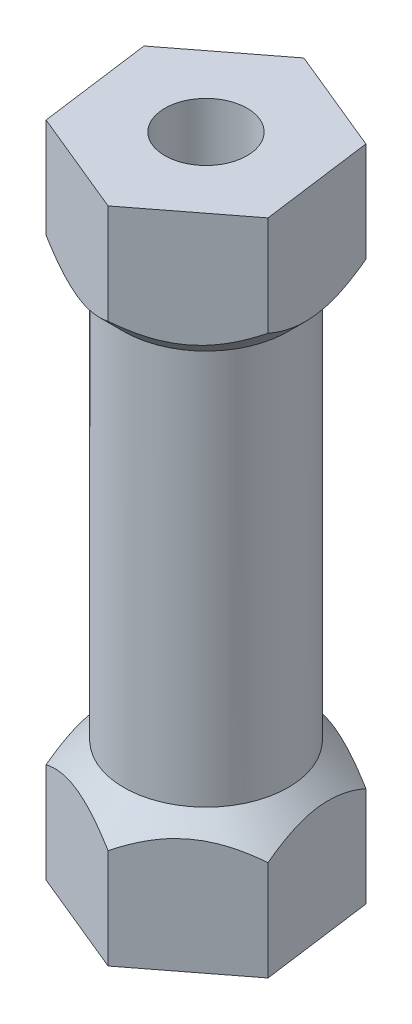
ISO-10303-21;
HEADER;
FILE_DESCRIPTION(('STEP AP214'),'2;1');
FILE_NAME('part.step','',(''),(''),'','','');
FILE_SCHEMA(('AUTOMOTIVE_DESIGN { 1 0 10303 214 1 1 1 1 }'));
ENDSEC;
DATA;
#1=APPLICATION_CONTEXT('core data for automotive mechanical design processes');
#2=APPLICATION_PROTOCOL_DEFINITION('international standard','automotive_design',2000,#1);
#3=PRODUCT_CONTEXT('',#1,'mechanical');
#4=PRODUCT('Part','Part','',(#3));
#5=PRODUCT_RELATED_PRODUCT_CATEGORY('part','',(#4));
#6=PRODUCT_DEFINITION_FORMATION('','',#4);
#7=PRODUCT_DEFINITION_CONTEXT('part definition',#1,'design');
#8=PRODUCT_DEFINITION('design','',#6,#7);
#9=PRODUCT_DEFINITION_SHAPE('','',#8);
#10=(LENGTH_UNIT() NAMED_UNIT(*) SI_UNIT(.MILLI.,.METRE.));
#11=(NAMED_UNIT(*) PLANE_ANGLE_UNIT() SI_UNIT($,.RADIAN.));
#12=(NAMED_UNIT(*) SI_UNIT($,.STERADIAN.) SOLID_ANGLE_UNIT());
#13=UNCERTAINTY_MEASURE_WITH_UNIT(LENGTH_MEASURE(1.E-05),#10,'distance_accuracy_value','');
#14=(GEOMETRIC_REPRESENTATION_CONTEXT(3) GLOBAL_UNCERTAINTY_ASSIGNED_CONTEXT((#13)) GLOBAL_UNIT_ASSIGNED_CONTEXT((#10,
#11,#12)) REPRESENTATION_CONTEXT('',''));
#15=CARTESIAN_POINT('',(0.,0.,0.));
#16=DIRECTION('',(0.,0.,1.));
#17=DIRECTION('',(1.,0.,0.));
#18=AXIS2_PLACEMENT_3D('',#15,#16,#17);
#19=CARTESIAN_POINT('',(0.,20.,0.));
#20=DIRECTION('',(0.,-1.,0.));
#21=DIRECTION('',(0.,0.,-1.));
#22=AXIS2_PLACEMENT_3D('',#19,#20,#21);
#23=CYLINDRICAL_SURFACE('',#22,2.5);
#24=CARTESIAN_POINT('',(0.,4.00000000000001,0.));
#25=DIRECTION('',(0.,-1.,0.));
#26=DIRECTION('',(0.,0.,-1.));
#27=AXIS2_PLACEMENT_3D('',#24,#25,#26);
#28=CIRCLE('',#27,2.5);
#29=CARTESIAN_POINT('',(0.,4.00000000000001,-2.5));
#30=VERTEX_POINT('',#29);
#31=EDGE_CURVE('E214',#30,#30,#28,.F.);
#32=ORIENTED_EDGE('',*,*,#31,.T.);
#33=EDGE_LOOP('',(#32));
#34=FACE_BOUND('',#33,.T.);
#35=CARTESIAN_POINT('',(0.,16.,0.));
#36=DIRECTION('',(0.,1.,0.));
#37=DIRECTION('',(0.,0.,1.));
#38=AXIS2_PLACEMENT_3D('',#35,#36,#37);
#39=CIRCLE('',#38,2.5);
#40=CARTESIAN_POINT('',(0.,16.,2.5));
#41=VERTEX_POINT('',#40);
#42=EDGE_CURVE('E204',#41,#41,#39,.F.);
#43=ORIENTED_EDGE('',*,*,#42,.T.);
#44=EDGE_LOOP('',(#43));
#45=FACE_BOUND('',#44,.T.);
#46=ADVANCED_FACE('F36',(#34,#45),#23,.T.);
#47=CARTESIAN_POINT('',(0.458624426145962,17.,3.43360796185911));
#48=DIRECTION('',(0.61025472680424,0.,0.792205256491701));
#49=DIRECTION('',(0.792205256491702,0.,-0.61025472680424));
#50=AXIS2_PLACEMENT_3D('',#47,#48,#49);
#51=PLANE('',#50);
#52=DIRECTION('',(0.792205256491701,0.,-0.61025472680424));
#53=VECTOR('',#52,1.);
#54=CARTESIAN_POINT('',(0.458624426145962,20.,3.43360796185911));
#55=LINE('',#54,#53);
#56=CARTESIAN_POINT('',(0.458624426145962,20.,3.43360796185911));
#57=VERTEX_POINT('',#56);
#58=CARTESIAN_POINT('',(3.20290393467948,20.,1.3196235770911));
#59=VERTEX_POINT('',#58);
#60=EDGE_CURVE('E176',#57,#59,#55,.T.);
#61=ORIENTED_EDGE('',*,*,#60,.F.);
#62=DIRECTION('',(0.,1.,0.));
#63=VECTOR('',#62,1.);
#64=CARTESIAN_POINT('',(0.458624426145962,17.,3.43360796185911));
#65=LINE('',#64,#63);
#66=CARTESIAN_POINT('',(0.458624426145962,16.9641016151377,3.43360796185911));
#67=VERTEX_POINT('',#66);
#68=EDGE_CURVE('E202',#67,#57,#65,.T.);
#69=ORIENTED_EDGE('',*,*,#68,.F.);
#70=CARTESIAN_POINT('',(0.458624426145962,16.9641016151377,3.43360796185911));
#71=CARTESIAN_POINT('',(0.552946646940671,16.9046273115043,3.36094929087585));
#72=CARTESIAN_POINT('',(0.648845946533506,16.8486466143714,3.28707575823494));
#73=CARTESIAN_POINT('',(0.844394459739393,16.7461483479953,3.13644004416266));
#74=CARTESIAN_POINT('',(0.944062259864258,16.6996877901198,3.05966354509507));
#75=CARTESIAN_POINT('',(1.14503747135759,16.6201005343435,2.90484751505832));
#76=CARTESIAN_POINT('',(1.24629372827786,16.586773851006,2.82684738958863));
#77=CARTESIAN_POINT('',(1.45103485264414,16.5354277758299,2.66913038646112));
#78=CARTESIAN_POINT('',(1.55451346985746,16.517370070364,2.58941832350757));
#79=CARTESIAN_POINT('',(1.73286339917489,16.5010768517386,2.45203109147486));
#80=CARTESIAN_POINT('',(1.80750452739339,16.4986656112775,2.39453323856858));
#81=CARTESIAN_POINT('',(1.9566652769835,16.502733133148,2.27963113239708));
#82=CARTESIAN_POINT('',(2.03118484660152,16.5092150115048,2.22222691899889));
#83=CARTESIAN_POINT('',(2.17951789139027,16.5306986609621,2.10796241370582));
#84=CARTESIAN_POINT('',(2.25333048312972,16.5457099577167,2.05110280233924));
#85=CARTESIAN_POINT('',(2.3996879271144,16.5834331286294,1.93836014977194));
#86=CARTESIAN_POINT('',(2.47223287613645,16.6061444122156,1.8824770340217));
#87=CARTESIAN_POINT('',(2.60100408474849,16.6528653293044,1.78328148073819));
#88=CARTESIAN_POINT('',(2.65751570690211,16.675645478675,1.73974922157174));
#89=CARTESIAN_POINT('',(2.76952470482908,16.7248761548282,1.65346600157362));
#90=CARTESIAN_POINT('',(2.82502204996649,16.7513267922701,1.61071506434156));
#91=CARTESIAN_POINT('',(2.93482762154907,16.8073056985693,1.52612919655211));
#92=CARTESIAN_POINT('',(2.989138970775,16.8368242879627,1.48429186044175));
#93=CARTESIAN_POINT('',(3.09675613798931,16.898551669424,1.40139177307215));
#94=CARTESIAN_POINT('',(3.15006254800882,16.9307588127747,1.36032856575713));
#95=CARTESIAN_POINT('',(3.20290393467948,16.9641016151377,1.3196235770911));
#96=B_SPLINE_CURVE_WITH_KNOTS('',3,(#70,#71,#72,#73,#74,#75,#76,#77,#78,#79,#80,#81,#82,#83,#84,
#85,#86,#87,#88,#89,#90,#91,#92,#93,#94,#95),.UNSPECIFIED.,.F.,.F.,(4,2,2,2,2,2,2,2,2,2,2,2,4),
(0.,0.399548839742044,0.801424624398822,1.19691998044429,1.59141997110855,1.87377108834638,
2.15622116275999,2.43898729915556,2.72173175291771,2.94627735489484,3.17082972803501,
3.39469398397017,3.61842195288712),.UNSPECIFIED.);
#97=CARTESIAN_POINT('',(3.20290393467948,16.9641016151377,1.3196235770911));
#98=VERTEX_POINT('',#97);
#99=EDGE_CURVE('E262',#67,#98,#96,.T.);
#100=ORIENTED_EDGE('',*,*,#99,.T.);
#101=DIRECTION('',(0.,1.,0.));
#102=VECTOR('',#101,1.);
#103=CARTESIAN_POINT('',(3.20290393467948,17.,1.3196235770911));
#104=LINE('',#103,#102);
#105=EDGE_CURVE('E201',#98,#59,#104,.T.);
#106=ORIENTED_EDGE('',*,*,#105,.T.);
#107=EDGE_LOOP('',(#61,#69,#100,#106));
#108=FACE_BOUND('',#107,.T.);
#109=ADVANCED_FACE('F273',(#108),#51,.T.);
#110=CARTESIAN_POINT('',(-2.74427950853352,17.,2.11398438476802));
#111=DIRECTION('',(-0.38094251373126,0.,0.924598724437855));
#112=DIRECTION('',(0.924598724437855,0.,0.380942513731261));
#113=AXIS2_PLACEMENT_3D('',#110,#111,#112);
#114=PLANE('',#113);
#115=DIRECTION('',(0.924598724437855,0.,0.38094251373126));
#116=VECTOR('',#115,1.);
#117=CARTESIAN_POINT('',(-2.74427950853352,20.,2.11398438476802));
#118=LINE('',#117,#116);
#119=CARTESIAN_POINT('',(-2.74427950853352,20.,2.11398438476802));
#120=VERTEX_POINT('',#119);
#121=EDGE_CURVE('E198',#120,#57,#118,.T.);
#122=ORIENTED_EDGE('',*,*,#121,.F.);
#123=DIRECTION('',(0.,1.,0.));
#124=VECTOR('',#123,1.);
#125=CARTESIAN_POINT('',(-2.74427950853352,17.,2.11398438476802));
#126=LINE('',#125,#124);
#127=CARTESIAN_POINT('',(-2.74427950853352,16.9641016151377,2.11398438476802));
#128=VERTEX_POINT('',#127);
#129=EDGE_CURVE('E55',#128,#120,#126,.T.);
#130=ORIENTED_EDGE('',*,*,#129,.F.);
#131=CARTESIAN_POINT('',(-2.74427950853352,16.9641016151377,2.11398438476802));
#132=CARTESIAN_POINT('',(-2.63349132278802,16.9042465561435,2.1596300566191));
#133=CARTESIAN_POINT('',(-2.5208306752984,16.8479276158537,2.20604719858453));
#134=CARTESIAN_POINT('',(-2.29101765072446,16.7448671131009,2.30073211319179));
#135=CARTESIAN_POINT('',(-2.17384124974193,16.6981887865374,2.34900978388337));
#136=CARTESIAN_POINT('',(-1.93912067100053,16.6189182952453,2.4457166524166));
#137=CARTESIAN_POINT('',(-1.82168615710399,16.5859561697386,2.49410066781718));
#138=CARTESIAN_POINT('',(-1.58429793865649,16.5351709539857,2.59190662652706));
#139=CARTESIAN_POINT('',(-1.46435309270892,16.5173016151636,2.64132492001665));
#140=CARTESIAN_POINT('',(-1.31052706825295,16.5052592473864,2.70470254631521));
#141=CARTESIAN_POINT('',(-1.27709425611575,16.5032939655895,2.71847714837774));
#142=CARTESIAN_POINT('',(-1.21005238331492,16.5006622772178,2.74609896839001));
#143=CARTESIAN_POINT('',(-1.17644314907664,16.5000010463362,2.75994625785399));
#144=CARTESIAN_POINT('',(-1.14282754119378,16.5,2.77379617331357));
#145=B_SPLINE_CURVE_WITH_KNOTS('',3,(#131,#132,#133,#134,#135,#136,#137,#138,#139,#140,#141,
#142,#143,#144),.UNSPECIFIED.,.F.,.F.,(4,2,2,2,2,2,4),(0.,0.402119025873333,0.806797313868012,
1.19971436997847,1.59142300305554,1.70004402806134,1.80909530210899),.UNSPECIFIED.);
#146=CARTESIAN_POINT('',(-1.14282754119378,16.5,2.77379617331357));
#147=VERTEX_POINT('',#146);
#148=EDGE_CURVE('E11',#128,#147,#145,.T.);
#149=ORIENTED_EDGE('',*,*,#148,.T.);
#150=CARTESIAN_POINT('',(-1.14282754119378,16.5,2.77379617331357));
#151=CARTESIAN_POINT('',(-1.10022501513962,16.4999963101781,2.79134877525582));
#152=CARTESIAN_POINT('',(-1.05762885810082,16.5010620671615,2.80889875310975));
#153=CARTESIAN_POINT('',(-0.972532570372322,16.5052977157884,2.8439591451476));
#154=CARTESIAN_POINT('',(-0.930032425632245,16.5084672764404,2.86146956512041));
#155=CARTESIAN_POINT('',(-0.802948427577587,16.5210634368764,2.91382924980783));
#156=CARTESIAN_POINT('',(-0.718612061023148,16.5335777900352,2.94857654787894));
#157=CARTESIAN_POINT('',(-0.552496648265973,16.5659327147617,3.01701750635387));
#158=CARTESIAN_POINT('',(-0.470698216277369,16.5856599472331,3.05071915386583));
#159=CARTESIAN_POINT('',(-0.308653419442774,16.6315827359299,3.11748298406771));
#160=CARTESIAN_POINT('',(-0.228407549190369,16.6577803179604,3.15054496298087));
#161=CARTESIAN_POINT('',(-0.0971701649973123,16.7056533901419,3.20461587797204));
#162=CARTESIAN_POINT('',(-0.0456767048713384,16.7257503469628,3.22583162013417));
#163=CARTESIAN_POINT('',(0.0565560250602171,16.768042758048,3.26795237165198));
#164=CARTESIAN_POINT('',(0.107295451337837,16.7902377696978,3.28885744547548));
#165=CARTESIAN_POINT('',(0.208559810145813,16.836730315952,3.33057921987999));
#166=CARTESIAN_POINT('',(0.259077099688516,16.8610472180228,3.35139277148529));
#167=CARTESIAN_POINT('',(0.359386521866436,16.9113651449045,3.39272110390174));
#168=CARTESIAN_POINT('',(0.409178702526936,16.9373660575531,3.4132359044997));
#169=CARTESIAN_POINT('',(0.458624426145963,16.9641016151377,3.43360796185912));
#170=B_SPLINE_CURVE_WITH_KNOTS('',3,(#150,#151,#152,#153,#154,#155,#156,#157,#158,#159,#160,
#161,#162,#163,#164,#165,#166,#167,#168,#169),.UNSPECIFIED.,.F.,.F.,(4,2,2,2,2,2,2,2,2,4),(0.,
0.138204825620452,0.276387912612568,0.552207964781785,0.823868153652891,1.0956135048085,
1.27319714786855,1.45074341038052,1.6301255414403,1.80949573715897),.UNSPECIFIED.);
#171=EDGE_CURVE('E251',#147,#67,#170,.T.);
#172=ORIENTED_EDGE('',*,*,#171,.T.);
#173=ORIENTED_EDGE('',*,*,#68,.T.);
#174=EDGE_LOOP('',(#122,#130,#149,#172,#173));
#175=FACE_BOUND('',#174,.T.);
#176=ADVANCED_FACE('F268',(#175),#114,.T.);
#177=CARTESIAN_POINT('',(-3.20290393467948,17.,-1.3196235770911));
#178=DIRECTION('',(-0.9911972405355,0.,0.132393467946154));
#179=DIRECTION('',(0.132393467946154,0.,0.991197240535501));
#180=AXIS2_PLACEMENT_3D('',#177,#178,#179);
#181=PLANE('',#180);
#182=DIRECTION('',(0.132393467946154,0.,0.991197240535501));
#183=VECTOR('',#182,1.);
#184=CARTESIAN_POINT('',(-3.20290393467948,20.,-1.3196235770911));
#185=LINE('',#184,#183);
#186=CARTESIAN_POINT('',(-3.20290393467948,20.,-1.3196235770911));
#187=VERTEX_POINT('',#186);
#188=EDGE_CURVE('E195',#187,#120,#185,.T.);
#189=ORIENTED_EDGE('',*,*,#188,.F.);
#190=DIRECTION('',(0.,1.,0.));
#191=VECTOR('',#190,1.);
#192=CARTESIAN_POINT('',(-3.20290393467948,17.,-1.3196235770911));
#193=LINE('',#192,#191);
#194=CARTESIAN_POINT('',(-3.20290393467948,16.9641016151377,-1.3196235770911));
#195=VERTEX_POINT('',#194);
#196=EDGE_CURVE('E62',#195,#187,#193,.T.);
#197=ORIENTED_EDGE('',*,*,#196,.F.);
#198=CARTESIAN_POINT('',(-3.20290393467948,16.9641016151377,-1.3196235770911));
#199=CARTESIAN_POINT('',(-3.18714079020011,16.9046273115043,-1.20160880224988));
#200=CARTESIAN_POINT('',(-3.1711140840622,16.8486466143714,-1.08162080627689));
#201=CARTESIAN_POINT('',(-3.13843398556135,16.7461483479953,-0.836952969132185));
#202=CARTESIAN_POINT('',(-3.12177748701761,16.6996877901198,-0.712249872750944));
#203=CARTESIAN_POINT('',(-3.0881904778394,16.6201005343435,-0.460792219048395));
#204=CARTESIAN_POINT('',(-3.07126851614441,16.586773851006,-0.334101665528472));
#205=CARTESIAN_POINT('',(-3.03705214701037,16.5354277758299,-0.0779321490641273));
#206=CARTESIAN_POINT('',(-3.0197587841112,16.517370070364,0.0515389936678654));
#207=CARTESIAN_POINT('',(-2.98995291567395,16.5010768517386,0.274688179236281));
#208=CARTESIAN_POINT('',(-2.9774788785033,16.4986656112775,0.368078218893769));
#209=CARTESIAN_POINT('',(-2.9525511104055,16.502733133148,0.554706270372082));
#210=CARTESIAN_POINT('',(-2.94009738812742,16.5092150115048,0.64794421743947));
#211=CARTESIAN_POINT('',(-2.91530794618713,16.5306986609621,0.833536655093753));
#212=CARTESIAN_POINT('',(-2.9029723741641,16.5457099577167,0.925890040342578));
#213=CARTESIAN_POINT('',(-2.87851309494311,16.5834331286294,1.10901063114992));
#214=CARTESIAN_POINT('',(-2.86638937157179,16.6061444122156,1.19977795779438));
#215=CARTESIAN_POINT('',(-2.84486910679185,16.6528653293044,1.36089487237019));
#216=CARTESIAN_POINT('',(-2.83542487554638,16.675645478675,1.43160150234752));
#217=CARTESIAN_POINT('',(-2.81670591407117,16.7248761548282,1.57174575000377));
#218=CARTESIAN_POINT('',(-2.80743118896132,16.7513267922701,1.64118332935139));
#219=CARTESIAN_POINT('',(-2.78908046444579,16.8073056985693,1.7785706777137));
#220=CARTESIAN_POINT('',(-2.78000394316052,16.8368242879627,1.84652435391235));
#221=CARTESIAN_POINT('',(-2.76201894512965,16.898551669424,1.98117359828805));
#222=CARTESIAN_POINT('',(-2.75311036944373,16.9307588127747,2.04786990720701));
#223=CARTESIAN_POINT('',(-2.74427950853352,16.9641016151377,2.11398438476802));
#224=B_SPLINE_CURVE_WITH_KNOTS('',3,(#198,#199,#200,#201,#202,#203,#204,#205,#206,#207,#208,
#209,#210,#211,#212,#213,#214,#215,#216,#217,#218,#219,#220,#221,#222,#223),.UNSPECIFIED.,.F.,
.F.,(4,2,2,2,2,2,2,2,2,2,2,2,4),(0.,0.399548839742042,0.801424624398821,1.19691998044429,
1.59141997110855,1.87377108834638,2.15622116275999,2.43898729915556,2.72173175291771,
2.94627735489484,3.17082972803501,3.39469398397017,3.61842195288713),.UNSPECIFIED.);
#225=EDGE_CURVE('E49',#195,#128,#224,.T.);
#226=ORIENTED_EDGE('',*,*,#225,.T.);
#227=ORIENTED_EDGE('',*,*,#129,.T.);
#228=EDGE_LOOP('',(#189,#197,#226,#227));
#229=FACE_BOUND('',#228,.T.);
#230=ADVANCED_FACE('F272',(#229),#181,.T.);
#231=CARTESIAN_POINT('',(-0.45862442614596,17.,-3.43360796185911));
#232=DIRECTION('',(-0.61025472680424,0.,-0.792205256491701));
#233=DIRECTION('',(-0.792205256491702,0.,0.61025472680424));
#234=AXIS2_PLACEMENT_3D('',#231,#232,#233);
#235=PLANE('',#234);
#236=DIRECTION('',(-0.792205256491701,0.,0.61025472680424));
#237=VECTOR('',#236,1.);
#238=CARTESIAN_POINT('',(-0.45862442614596,20.,-3.43360796185911));
#239=LINE('',#238,#237);
#240=CARTESIAN_POINT('',(-0.45862442614596,20.,-3.43360796185911));
#241=VERTEX_POINT('',#240);
#242=EDGE_CURVE('E192',#241,#187,#239,.T.);
#243=ORIENTED_EDGE('',*,*,#242,.F.);
#244=DIRECTION('',(0.,1.,0.));
#245=VECTOR('',#244,1.);
#246=CARTESIAN_POINT('',(-0.45862442614596,17.,-3.43360796185911));
#247=LINE('',#246,#245);
#248=CARTESIAN_POINT('',(-0.45862442614596,16.9641016151377,-3.43360796185911));
#249=VERTEX_POINT('',#248);
#250=EDGE_CURVE('E207',#249,#241,#247,.T.);
#251=ORIENTED_EDGE('',*,*,#250,.F.);
#252=CARTESIAN_POINT('',(-0.45862442614596,16.9641016151377,-3.43360796185911));
#253=CARTESIAN_POINT('',(-0.552946646940669,16.9046273115043,-3.36094929087585));
#254=CARTESIAN_POINT('',(-0.648845946533503,16.8486466143714,-3.28707575823493));
#255=CARTESIAN_POINT('',(-0.84439445973939,16.7461483479953,-3.13644004416266));
#256=CARTESIAN_POINT('',(-0.944062259864255,16.6996877901198,-3.05966354509507));
#257=CARTESIAN_POINT('',(-1.14503747135759,16.6201005343435,-2.90484751505832));
#258=CARTESIAN_POINT('',(-1.24629372827786,16.586773851006,-2.82684738958863));
#259=CARTESIAN_POINT('',(-1.45103485264414,16.5354277758299,-2.66913038646112));
#260=CARTESIAN_POINT('',(-1.55451346985746,16.517370070364,-2.58941832350757));
#261=CARTESIAN_POINT('',(-1.73286339917489,16.5010768517386,-2.45203109147485));
#262=CARTESIAN_POINT('',(-1.80750452739338,16.4986656112775,-2.39453323856858));
#263=CARTESIAN_POINT('',(-1.95666527698349,16.502733133148,-2.27963113239708));
#264=CARTESIAN_POINT('',(-2.03118484660152,16.5092150115048,-2.22222691899889));
#265=CARTESIAN_POINT('',(-2.17951789139026,16.5306986609621,-2.10796241370582));
#266=CARTESIAN_POINT('',(-2.25333048312972,16.5457099577167,-2.05110280233924));
#267=CARTESIAN_POINT('',(-2.3996879271144,16.5834331286294,-1.93836014977194));
#268=CARTESIAN_POINT('',(-2.47223287613644,16.6061444122156,-1.8824770340217));
#269=CARTESIAN_POINT('',(-2.60100408474849,16.6528653293044,-1.78328148073819));
#270=CARTESIAN_POINT('',(-2.65751570690211,16.675645478675,-1.73974922157174));
#271=CARTESIAN_POINT('',(-2.76952470482908,16.7248761548282,-1.65346600157362));
#272=CARTESIAN_POINT('',(-2.82502204996649,16.7513267922701,-1.61071506434155));
#273=CARTESIAN_POINT('',(-2.93482762154907,16.8073056985693,-1.52612919655211));
#274=CARTESIAN_POINT('',(-2.989138970775,16.8368242879627,-1.48429186044174));
#275=CARTESIAN_POINT('',(-3.09675613798931,16.898551669424,-1.40139177307215));
#276=CARTESIAN_POINT('',(-3.15006254800882,16.9307588127747,-1.36032856575712));
#277=CARTESIAN_POINT('',(-3.20290393467948,16.9641016151377,-1.3196235770911));
#278=B_SPLINE_CURVE_WITH_KNOTS('',3,(#252,#253,#254,#255,#256,#257,#258,#259,#260,#261,#262,
#263,#264,#265,#266,#267,#268,#269,#270,#271,#272,#273,#274,#275,#276,#277),.UNSPECIFIED.,.F.,
.F.,(4,2,2,2,2,2,2,2,2,2,2,2,4),(0.,0.399548839742042,0.801424624398821,1.19691998044429,
1.59141997110855,1.87377108834638,2.15622116275999,2.43898729915555,2.72173175291771,
2.94627735489484,3.17082972803501,3.39469398397017,3.61842195288712),.UNSPECIFIED.);
#279=EDGE_CURVE('E287',#249,#195,#278,.T.);
#280=ORIENTED_EDGE('',*,*,#279,.T.);
#281=ORIENTED_EDGE('',*,*,#196,.T.);
#282=EDGE_LOOP('',(#243,#251,#280,#281));
#283=FACE_BOUND('',#282,.T.);
#284=ADVANCED_FACE('F280',(#283),#235,.T.);
#285=CARTESIAN_POINT('',(2.74427950853352,17.,-2.11398438476802));
#286=DIRECTION('',(0.380942513731261,0.,-0.924598724437855));
#287=DIRECTION('',(-0.924598724437855,0.,-0.380942513731261));
#288=AXIS2_PLACEMENT_3D('',#285,#286,#287);
#289=PLANE('',#288);
#290=DIRECTION('',(-0.924598724437855,0.,-0.380942513731261));
#291=VECTOR('',#290,1.);
#292=CARTESIAN_POINT('',(2.74427950853352,20.,-2.11398438476802));
#293=LINE('',#292,#291);
#294=CARTESIAN_POINT('',(2.74427950853352,20.,-2.11398438476802));
#295=VERTEX_POINT('',#294);
#296=EDGE_CURVE('E189',#295,#241,#293,.T.);
#297=ORIENTED_EDGE('',*,*,#296,.F.);
#298=DIRECTION('',(0.,1.,0.));
#299=VECTOR('',#298,1.);
#300=CARTESIAN_POINT('',(2.74427950853352,17.,-2.11398438476802));
#301=LINE('',#300,#299);
#302=CARTESIAN_POINT('',(2.74427950853352,16.9641016151377,-2.11398438476802));
#303=VERTEX_POINT('',#302);
#304=EDGE_CURVE('E209',#303,#295,#301,.T.);
#305=ORIENTED_EDGE('',*,*,#304,.F.);
#306=CARTESIAN_POINT('',(2.74427950853352,16.9641016151377,-2.11398438476802));
#307=CARTESIAN_POINT('',(2.63419414325944,16.9046273115043,-2.15934048862597));
#308=CARTESIAN_POINT('',(2.5222681375287,16.8486466143714,-2.20545495195804));
#309=CARTESIAN_POINT('',(2.29403952582196,16.7461483479953,-2.29948707503048));
#310=CARTESIAN_POINT('',(2.17771522715335,16.6996877901198,-2.34741367234412));
#311=CARTESIAN_POINT('',(1.94315300648181,16.6201005343435,-2.44405529600993));
#312=CARTESIAN_POINT('',(1.82497478786655,16.586773851006,-2.49274572406016));
#313=CARTESIAN_POINT('',(1.58601729436623,16.5354277758299,-2.59119823739699));
#314=CARTESIAN_POINT('',(1.46524531425374,16.517370070364,-2.64095731717544));
#315=CARTESIAN_POINT('',(1.25708951649906,16.5010768517386,-2.72671927071113));
#316=CARTESIAN_POINT('',(1.16997435110992,16.4986656112775,-2.76261145746235));
#317=CARTESIAN_POINT('',(0.995885833422009,16.502733133148,-2.83433740276916));
#318=CARTESIAN_POINT('',(0.908912541525901,16.5092150115048,-2.87017113643836));
#319=CARTESIAN_POINT('',(0.735790054796867,16.5306986609621,-2.94149906879957));
#320=CARTESIAN_POINT('',(0.649641891034376,16.5457099577167,-2.97699284268182));
#321=CARTESIAN_POINT('',(0.478825167828706,16.5834331286294,-3.04737078092186));
#322=CARTESIAN_POINT('',(0.394156495435349,16.6061444122156,-3.08225499181607));
#323=CARTESIAN_POINT('',(0.243865022043358,16.6528653293044,-3.14417635310838));
#324=CARTESIAN_POINT('',(0.177909168644273,16.675645478675,-3.17135072391926));
#325=CARTESIAN_POINT('',(0.0471812092420944,16.7248761548282,-3.22521175157739));
#326=CARTESIAN_POINT('',(-0.0175908610051715,16.7513267922701,-3.25189839369295));
#327=CARTESIAN_POINT('',(-0.145747157103273,16.8073056985693,-3.30469987426581));
#328=CARTESIAN_POINT('',(-0.209135027614486,16.8368242879627,-3.33081621435409));
#329=CARTESIAN_POINT('',(-0.334737192859661,16.898551669424,-3.38256537136021));
#330=CARTESIAN_POINT('',(-0.396952178565091,16.9307588127747,-3.40819847296414));
#331=CARTESIAN_POINT('',(-0.45862442614596,16.9641016151377,-3.43360796185911));
#332=B_SPLINE_CURVE_WITH_KNOTS('',3,(#306,#307,#308,#309,#310,#311,#312,#313,#314,#315,#316,
#317,#318,#319,#320,#321,#322,#323,#324,#325,#326,#327,#328,#329,#330,#331),.UNSPECIFIED.,.F.,
.F.,(4,2,2,2,2,2,2,2,2,2,2,2,4),(0.,0.399548839742044,0.801424624398823,1.19691998044429,
1.59141997110856,1.87377108834638,2.15622116275999,2.43898729915556,2.72173175291771,
2.94627735489484,3.17082972803501,3.39469398397018,3.61842195288713),.UNSPECIFIED.);
#333=EDGE_CURVE('E292',#303,#249,#332,.T.);
#334=ORIENTED_EDGE('',*,*,#333,.T.);
#335=ORIENTED_EDGE('',*,*,#250,.T.);
#336=EDGE_LOOP('',(#297,#305,#334,#335));
#337=FACE_BOUND('',#336,.T.);
#338=ADVANCED_FACE('F302',(#337),#289,.T.);
#339=CARTESIAN_POINT('',(3.20290393467948,17.,1.3196235770911));
#340=DIRECTION('',(0.9911972405355,0.,-0.132393467946154));
#341=DIRECTION('',(-0.132393467946154,0.,-0.991197240535501));
#342=AXIS2_PLACEMENT_3D('',#339,#340,#341);
#343=PLANE('',#342);
#344=DIRECTION('',(-0.132393467946154,0.,-0.991197240535501));
#345=VECTOR('',#344,1.);
#346=CARTESIAN_POINT('',(3.20290393467948,20.,1.3196235770911));
#347=LINE('',#346,#345);
#348=EDGE_CURVE('E186',#59,#295,#347,.T.);
#349=ORIENTED_EDGE('',*,*,#348,.F.);
#350=ORIENTED_EDGE('',*,*,#105,.F.);
#351=CARTESIAN_POINT('',(3.20290393467948,16.9641016151377,1.3196235770911));
#352=CARTESIAN_POINT('',(3.18714079020011,16.9046273115043,1.20160880224988));
#353=CARTESIAN_POINT('',(3.1711140840622,16.8486466143714,1.0816208062769));
#354=CARTESIAN_POINT('',(3.13843398556135,16.7461483479953,0.836952969132185));
#355=CARTESIAN_POINT('',(3.12177748701761,16.6996877901198,0.712249872750943));
#356=CARTESIAN_POINT('',(3.0881904778394,16.6201005343435,0.460792219048394));
#357=CARTESIAN_POINT('',(3.07126851614441,16.586773851006,0.334101665528469));
#358=CARTESIAN_POINT('',(3.03705214701037,16.5354277758299,0.0779321490641238));
#359=CARTESIAN_POINT('',(3.0197587841112,16.517370070364,-0.0515389936678695));
#360=CARTESIAN_POINT('',(2.98995291567395,16.5010768517386,-0.274688179236285));
#361=CARTESIAN_POINT('',(2.9774788785033,16.4986656112775,-0.368078218893773));
#362=CARTESIAN_POINT('',(2.9525511104055,16.502733133148,-0.554706270372087));
#363=CARTESIAN_POINT('',(2.94009738812742,16.5092150115048,-0.647944217439475));
#364=CARTESIAN_POINT('',(2.91530794618713,16.5306986609621,-0.833536655093758));
#365=CARTESIAN_POINT('',(2.9029723741641,16.5457099577167,-0.925890040342583));
#366=CARTESIAN_POINT('',(2.87851309494311,16.5834331286294,-1.10901063114993));
#367=CARTESIAN_POINT('',(2.86638937157179,16.6061444122156,-1.19977795779439));
#368=CARTESIAN_POINT('',(2.84486910679185,16.6528653293044,-1.36089487237019));
#369=CARTESIAN_POINT('',(2.83542487554638,16.675645478675,-1.43160150234752));
#370=CARTESIAN_POINT('',(2.81670591407117,16.7248761548282,-1.57174575000378));
#371=CARTESIAN_POINT('',(2.80743118896132,16.7513267922701,-1.64118332935139));
#372=CARTESIAN_POINT('',(2.78908046444579,16.8073056985693,-1.7785706777137));
#373=CARTESIAN_POINT('',(2.78000394316052,16.8368242879627,-1.84652435391235));
#374=CARTESIAN_POINT('',(2.76201894512965,16.898551669424,-1.98117359828806));
#375=CARTESIAN_POINT('',(2.75311036944373,16.9307588127747,-2.04786990720701));
#376=CARTESIAN_POINT('',(2.74427950853352,16.9641016151377,-2.11398438476802));
#377=B_SPLINE_CURVE_WITH_KNOTS('',3,(#351,#352,#353,#354,#355,#356,#357,#358,#359,#360,#361,
#362,#363,#364,#365,#366,#367,#368,#369,#370,#371,#372,#373,#374,#375,#376),.UNSPECIFIED.,.F.,
.F.,(4,2,2,2,2,2,2,2,2,2,2,2,4),(0.,0.399548839742046,0.801424624398827,1.19691998044429,
1.59141997110856,1.87377108834639,2.15622116276,2.43898729915557,2.72173175291772,
2.94627735489485,3.17082972803502,3.39469398397018,3.61842195288713),.UNSPECIFIED.);
#378=EDGE_CURVE('E297',#98,#303,#377,.T.);
#379=ORIENTED_EDGE('',*,*,#378,.T.);
#380=ORIENTED_EDGE('',*,*,#304,.T.);
#381=EDGE_LOOP('',(#349,#350,#379,#380));
#382=FACE_BOUND('',#381,.T.);
#383=ADVANCED_FACE('F305',(#382),#343,.T.);
#384=CARTESIAN_POINT('',(0.,20.,0.));
#385=DIRECTION('',(0.,1.,0.));
#386=DIRECTION('',(0.,0.,1.));
#387=AXIS2_PLACEMENT_3D('',#384,#385,#386);
#388=PLANE('',#387);
#389=CARTESIAN_POINT('',(0.,20.,0.));
#390=DIRECTION('',(0.,-1.,0.));
#391=DIRECTION('',(0.,0.,-1.));
#392=AXIS2_PLACEMENT_3D('',#389,#390,#391);
#393=CIRCLE('',#392,1.25);
#394=CARTESIAN_POINT('',(0.,20.,-1.25));
#395=VERTEX_POINT('',#394);
#396=EDGE_CURVE('E509',#395,#395,#393,.T.);
#397=ORIENTED_EDGE('',*,*,#396,.T.);
#398=EDGE_LOOP('',(#397));
#399=FACE_BOUND('',#398,.T.);
#400=ORIENTED_EDGE('',*,*,#60,.T.);
#401=ORIENTED_EDGE('',*,*,#348,.T.);
#402=ORIENTED_EDGE('',*,*,#296,.T.);
#403=ORIENTED_EDGE('',*,*,#242,.T.);
#404=ORIENTED_EDGE('',*,*,#188,.T.);
#405=ORIENTED_EDGE('',*,*,#121,.T.);
#406=EDGE_LOOP('',(#400,#401,#402,#403,#404,#405));
#407=FACE_BOUND('',#406,.T.);
#408=ADVANCED_FACE('F309',(#399,#407),#388,.T.);
#409=CARTESIAN_POINT('',(2.74427950853352,3.,-2.11398438476802));
#410=DIRECTION('',(0.9911972405355,0.,-0.132393467946154));
#411=DIRECTION('',(-0.132393467946154,0.,-0.991197240535501));
#412=AXIS2_PLACEMENT_3D('',#409,#410,#411);
#413=PLANE('',#412);
#414=DIRECTION('',(0.132393467946154,0.,0.991197240535501));
#415=VECTOR('',#414,1.);
#416=CARTESIAN_POINT('',(2.74427950853352,0.,-2.11398438476802));
#417=LINE('',#416,#415);
#418=CARTESIAN_POINT('',(2.74427950853352,0.,-2.11398438476802));
#419=VERTEX_POINT('',#418);
#420=CARTESIAN_POINT('',(3.20290393467948,0.,1.3196235770911));
#421=VERTEX_POINT('',#420);
#422=EDGE_CURVE('E139',#419,#421,#417,.T.);
#423=ORIENTED_EDGE('',*,*,#422,.F.);
#424=DIRECTION('',(0.,-1.,0.));
#425=VECTOR('',#424,1.);
#426=CARTESIAN_POINT('',(2.74427950853352,3.,-2.11398438476802));
#427=LINE('',#426,#425);
#428=CARTESIAN_POINT('',(2.74427950853352,3.03589838486226,-2.11398438476802));
#429=VERTEX_POINT('',#428);
#430=EDGE_CURVE('E174',#429,#419,#427,.T.);
#431=ORIENTED_EDGE('',*,*,#430,.F.);
#432=CARTESIAN_POINT('',(2.74427950853352,3.03589838486226,-2.11398438476802));
#433=CARTESIAN_POINT('',(2.76004265301289,3.09537268849571,-1.9959696099268));
#434=CARTESIAN_POINT('',(2.7760693591508,3.15135338562856,-1.87598161395381));
#435=CARTESIAN_POINT('',(2.80874945765166,3.2538516520047,-1.6313137768091));
#436=CARTESIAN_POINT('',(2.82540595619539,3.30031220988016,-1.50661068042786));
#437=CARTESIAN_POINT('',(2.8589929653736,3.37989946565652,-1.25515302672532));
#438=CARTESIAN_POINT('',(2.87591492706859,3.413226148994,-1.12846247320539));
#439=CARTESIAN_POINT('',(2.91013129620263,3.46457222417013,-0.872292956741048));
#440=CARTESIAN_POINT('',(2.92742465910181,3.48262992963597,-0.742821814009056));
#441=CARTESIAN_POINT('',(2.95723052753905,3.49892314826136,-0.519672628440641));
#442=CARTESIAN_POINT('',(2.9697045647097,3.50133438872248,-0.426282588783153));
#443=CARTESIAN_POINT('',(2.9946323328075,3.49726686685198,-0.239654537304839));
#444=CARTESIAN_POINT('',(3.00708605508558,3.49078498849517,-0.146416590237452));
#445=CARTESIAN_POINT('',(3.03187549702587,3.4693013390379,0.0391758474168316));
#446=CARTESIAN_POINT('',(3.04421106904891,3.45429004228332,0.131529232665657));
#447=CARTESIAN_POINT('',(3.0686703482699,3.41656687137056,0.314649823473001));
#448=CARTESIAN_POINT('',(3.08079407164121,3.39385558778436,0.405417150117458));
#449=CARTESIAN_POINT('',(3.10231433642116,3.34713467069564,0.566534064693268));
#450=CARTESIAN_POINT('',(3.11175856766662,3.32435452132502,0.637240694670597));
#451=CARTESIAN_POINT('',(3.13047752914183,3.27512384517184,0.777384942326852));
#452=CARTESIAN_POINT('',(3.13975225425169,3.24867320772993,0.846822521674472));
#453=CARTESIAN_POINT('',(3.15810297876721,3.19269430143066,0.984209870036779));
#454=CARTESIAN_POINT('',(3.16717950005249,3.1631757120373,1.05216354623543));
#455=CARTESIAN_POINT('',(3.18516449808335,3.10144833057595,1.18681279061114));
#456=CARTESIAN_POINT('',(3.19407307376928,3.06924118722529,1.25350909953009));
#457=CARTESIAN_POINT('',(3.20290393467948,3.03589838486226,1.3196235770911));
#458=B_SPLINE_CURVE_WITH_KNOTS('',3,(#432,#433,#434,#435,#436,#437,#438,#439,#440,#441,#442,
#443,#444,#445,#446,#447,#448,#449,#450,#451,#452,#453,#454,#455,#456,#457),.UNSPECIFIED.,.F.,
.F.,(4,2,2,2,2,2,2,2,2,2,2,2,4),(0.,0.399548839742044,0.801424624398822,1.19691998044429,
1.59141997110855,1.87377108834638,2.15622116275999,2.43898729915556,2.72173175291771,
2.94627735489484,3.17082972803501,3.39469398397018,3.61842195288713),.UNSPECIFIED.);
#459=CARTESIAN_POINT('',(3.20290393467948,3.03589838486226,1.3196235770911));
#460=VERTEX_POINT('',#459);
#461=EDGE_CURVE('E142',#429,#460,#458,.T.);
#462=ORIENTED_EDGE('',*,*,#461,.T.);
#463=DIRECTION('',(0.,-1.,0.));
#464=VECTOR('',#463,1.);
#465=CARTESIAN_POINT('',(3.20290393467948,3.,1.3196235770911));
#466=LINE('',#465,#464);
#467=EDGE_CURVE('E135',#460,#421,#466,.T.);
#468=ORIENTED_EDGE('',*,*,#467,.T.);
#469=EDGE_LOOP('',(#423,#431,#462,#468));
#470=FACE_BOUND('',#469,.T.);
#471=ADVANCED_FACE('F137',(#470),#413,.T.);
#472=CARTESIAN_POINT('',(-0.45862442614596,3.,-3.43360796185911));
#473=DIRECTION('',(0.380942513731261,0.,-0.924598724437855));
#474=DIRECTION('',(-0.924598724437855,0.,-0.380942513731261));
#475=AXIS2_PLACEMENT_3D('',#472,#473,#474);
#476=PLANE('',#475);
#477=DIRECTION('',(0.924598724437855,0.,0.380942513731261));
#478=VECTOR('',#477,1.);
#479=CARTESIAN_POINT('',(-0.45862442614596,0.,-3.43360796185911));
#480=LINE('',#479,#478);
#481=CARTESIAN_POINT('',(-0.45862442614596,0.,-3.43360796185911));
#482=VERTEX_POINT('',#481);
#483=EDGE_CURVE('E147',#482,#419,#480,.T.);
#484=ORIENTED_EDGE('',*,*,#483,.F.);
#485=DIRECTION('',(0.,-1.,0.));
#486=VECTOR('',#485,1.);
#487=CARTESIAN_POINT('',(-0.45862442614596,3.,-3.43360796185911));
#488=LINE('',#487,#486);
#489=CARTESIAN_POINT('',(-0.45862442614596,3.03589838486226,-3.43360796185911));
#490=VERTEX_POINT('',#489);
#491=EDGE_CURVE('E177',#490,#482,#488,.T.);
#492=ORIENTED_EDGE('',*,*,#491,.F.);
#493=CARTESIAN_POINT('',(-0.45862442614596,3.03589838486226,-3.43360796185911));
#494=CARTESIAN_POINT('',(-0.347836240400463,3.09575344385654,-3.38796229000804));
#495=CARTESIAN_POINT('',(-0.235175592910838,3.15207238414628,-3.3415451480426));
#496=CARTESIAN_POINT('',(-0.00536256833690058,3.25513288689908,-3.24686023343534));
#497=CARTESIAN_POINT('',(0.111813832645635,3.30181121346263,-3.19858256274376));
#498=CARTESIAN_POINT('',(0.346534411387031,3.38108170475469,-3.10187569421053));
#499=CARTESIAN_POINT('',(0.463968925283569,3.41404383026143,-3.05349167880995));
#500=CARTESIAN_POINT('',(0.701357143731073,3.46482904601429,-2.95568572010007));
#501=CARTESIAN_POINT('',(0.82130198967864,3.48269838483643,-2.90626742661048));
#502=CARTESIAN_POINT('',(0.975128014134614,3.49474075261356,-2.84288980031192));
#503=CARTESIAN_POINT('',(1.00856082627182,3.49670603441049,-2.82911519824939));
#504=CARTESIAN_POINT('',(1.07560269907264,3.49933772278218,-2.80149337823712));
#505=CARTESIAN_POINT('',(1.10921193331092,3.4999989536638,-2.78764608877314));
#506=CARTESIAN_POINT('',(1.14282754119378,3.50000000000001,-2.77379617331357));
#507=B_SPLINE_CURVE_WITH_KNOTS('',3,(#493,#494,#495,#496,#497,#498,#499,#500,#501,#502,#503,
#504,#505,#506),.UNSPECIFIED.,.F.,.F.,(4,2,2,2,2,2,4),(0.,0.402119025873334,0.806797313868012,
1.19971436997847,1.59142300305554,1.70004402806134,1.80909530210899),.UNSPECIFIED.);
#508=CARTESIAN_POINT('',(1.14282754119378,3.50000000000001,-2.77379617331357));
#509=VERTEX_POINT('',#508);
#510=EDGE_CURVE('E245',#490,#509,#507,.T.);
#511=ORIENTED_EDGE('',*,*,#510,.T.);
#512=CARTESIAN_POINT('',(1.14282754119378,3.50000000000001,-2.77379617331357));
#513=CARTESIAN_POINT('',(1.18543006724794,3.50000368982189,-2.75624357137131));
#514=CARTESIAN_POINT('',(1.22802622428674,3.49893793283854,-2.73869359351739));
#515=CARTESIAN_POINT('',(1.31312251201524,3.49470228421156,-2.70363320147953));
#516=CARTESIAN_POINT('',(1.35562265675531,3.4915327235596,-2.68612278150673));
#517=CARTESIAN_POINT('',(1.48270665480997,3.47893656312365,-2.6337630968193));
#518=CARTESIAN_POINT('',(1.56704302136441,3.46642220996482,-2.59901579874819));
#519=CARTESIAN_POINT('',(1.73315843412159,3.43406728523826,-2.53057484027326));
#520=CARTESIAN_POINT('',(1.81495686611019,3.4143400527669,-2.4968731927613));
#521=CARTESIAN_POINT('',(1.97700166294479,3.36841726407007,-2.43010936255942));
#522=CARTESIAN_POINT('',(2.05724753319719,3.34221968203962,-2.39704738364626));
#523=CARTESIAN_POINT('',(2.18848491739025,3.29434660985809,-2.34297646865509));
#524=CARTESIAN_POINT('',(2.23997837751622,3.27424965303724,-2.32176072649296));
#525=CARTESIAN_POINT('',(2.34221110744778,3.231957241952,-2.27963997497515));
#526=CARTESIAN_POINT('',(2.3929505337254,3.20976223030223,-2.25873490115166));
#527=CARTESIAN_POINT('',(2.49421489253337,3.16326968404803,-2.21701312674715));
#528=CARTESIAN_POINT('',(2.54473218207608,3.13895278197716,-2.19619957514184));
#529=CARTESIAN_POINT('',(2.645041604254,3.08863485509552,-2.1548712427254));
#530=CARTESIAN_POINT('',(2.6948337849145,3.06263394244691,-2.13435644212744));
#531=CARTESIAN_POINT('',(2.74427950853352,3.03589838486226,-2.11398438476802));
#532=B_SPLINE_CURVE_WITH_KNOTS('',3,(#512,#513,#514,#515,#516,#517,#518,#519,#520,#521,#522,
#523,#524,#525,#526,#527,#528,#529,#530,#531),.UNSPECIFIED.,.F.,.F.,(4,2,2,2,2,2,2,2,2,4),(0.,
0.138204825620452,0.276387912612567,0.552207964781785,0.823868153652891,1.0956135048085,
1.27319714786854,1.45074341038051,1.6301255414403,1.80949573715897),.UNSPECIFIED.);
#533=EDGE_CURVE('E217',#509,#429,#532,.T.);
#534=ORIENTED_EDGE('',*,*,#533,.T.);
#535=ORIENTED_EDGE('',*,*,#430,.T.);
#536=EDGE_LOOP('',(#484,#492,#511,#534,#535));
#537=FACE_BOUND('',#536,.T.);
#538=ADVANCED_FACE('F232',(#537),#476,.T.);
#539=CARTESIAN_POINT('',(-3.20290393467948,3.,-1.3196235770911));
#540=DIRECTION('',(-0.61025472680424,0.,-0.792205256491701));
#541=DIRECTION('',(-0.792205256491702,0.,0.61025472680424));
#542=AXIS2_PLACEMENT_3D('',#539,#540,#541);
#543=PLANE('',#542);
#544=DIRECTION('',(0.792205256491701,0.,-0.61025472680424));
#545=VECTOR('',#544,1.);
#546=CARTESIAN_POINT('',(-3.20290393467948,0.,-1.3196235770911));
#547=LINE('',#546,#545);
#548=CARTESIAN_POINT('',(-3.20290393467948,0.,-1.3196235770911));
#549=VERTEX_POINT('',#548);
#550=EDGE_CURVE('E171',#549,#482,#547,.T.);
#551=ORIENTED_EDGE('',*,*,#550,.F.);
#552=DIRECTION('',(0.,-1.,0.));
#553=VECTOR('',#552,1.);
#554=CARTESIAN_POINT('',(-3.20290393467948,3.,-1.3196235770911));
#555=LINE('',#554,#553);
#556=CARTESIAN_POINT('',(-3.20290393467948,3.03589838486226,-1.3196235770911));
#557=VERTEX_POINT('',#556);
#558=EDGE_CURVE('E179',#557,#549,#555,.T.);
#559=ORIENTED_EDGE('',*,*,#558,.F.);
#560=CARTESIAN_POINT('',(-3.20290393467948,3.03589838486226,-1.3196235770911));
#561=CARTESIAN_POINT('',(-3.10858171388477,3.09537268849571,-1.39228224807436));
#562=CARTESIAN_POINT('',(-3.01268241429194,3.15135338562856,-1.46615578071528));
#563=CARTESIAN_POINT('',(-2.81713390108605,3.2538516520047,-1.61679149478755));
#564=CARTESIAN_POINT('',(-2.71746610096119,3.30031220988015,-1.69356799385514));
#565=CARTESIAN_POINT('',(-2.51649088946785,3.37989946565651,-1.84838402389189));
#566=CARTESIAN_POINT('',(-2.41523463254758,3.413226148994,-1.92638414936158));
#567=CARTESIAN_POINT('',(-2.2104935081813,3.46457222417013,-2.08410115248909));
#568=CARTESIAN_POINT('',(-2.10701489096799,3.48262992963597,-2.16381321544264));
#569=CARTESIAN_POINT('',(-1.92866496165055,3.49892314826136,-2.30120044747536));
#570=CARTESIAN_POINT('',(-1.85402383343206,3.50133438872248,-2.35869830038163));
#571=CARTESIAN_POINT('',(-1.70486308384195,3.49726686685198,-2.47360040655313));
#572=CARTESIAN_POINT('',(-1.63034351422392,3.49078498849517,-2.53100461995132));
#573=CARTESIAN_POINT('',(-1.48201046943518,3.4693013390379,-2.64526912524439));
#574=CARTESIAN_POINT('',(-1.40819787769572,3.45429004228332,-2.70212873661097));
#575=CARTESIAN_POINT('',(-1.26184043371104,3.41656687137056,-2.81487138917827));
#576=CARTESIAN_POINT('',(-1.189295484689,3.39385558778435,-2.87075450492851));
#577=CARTESIAN_POINT('',(-1.06052427607695,3.34713467069563,-2.96995005821202));
#578=CARTESIAN_POINT('',(-1.00401265392333,3.32435452132502,-3.01348231737847));
#579=CARTESIAN_POINT('',(-0.892003655996361,3.27512384517184,-3.09976553737659));
#580=CARTESIAN_POINT('',(-0.836506310858955,3.24867320772993,-3.14251647460865));
#581=CARTESIAN_POINT('',(-0.726700739276376,3.19269430143066,-3.2271023423981));
#582=CARTESIAN_POINT('',(-0.672389390050442,3.1631757120373,-3.26893967850847));
#583=CARTESIAN_POINT('',(-0.564772222836132,3.10144833057595,-3.35183976587806));
#584=CARTESIAN_POINT('',(-0.511465812816624,3.06924118722529,-3.39290297319308));
#585=CARTESIAN_POINT('',(-0.45862442614596,3.03589838486226,-3.43360796185911));
#586=B_SPLINE_CURVE_WITH_KNOTS('',3,(#560,#561,#562,#563,#564,#565,#566,#567,#568,#569,#570,
#571,#572,#573,#574,#575,#576,#577,#578,#579,#580,#581,#582,#583,#584,#585),.UNSPECIFIED.,.F.,
.F.,(4,2,2,2,2,2,2,2,2,2,2,2,4),(0.,0.399548839742043,0.801424624398822,1.19691998044429,
1.59141997110855,1.87377108834638,2.15622116275999,2.43898729915556,2.72173175291771,
2.94627735489484,3.17082972803501,3.39469398397017,3.61842195288713),.UNSPECIFIED.);
#587=EDGE_CURVE('E252',#557,#490,#586,.T.);
#588=ORIENTED_EDGE('',*,*,#587,.T.);
#589=ORIENTED_EDGE('',*,*,#491,.T.);
#590=EDGE_LOOP('',(#551,#559,#588,#589));
#591=FACE_BOUND('',#590,.T.);
#592=ADVANCED_FACE('F237',(#591),#543,.T.);
#593=CARTESIAN_POINT('',(-2.74427950853352,3.,2.11398438476802));
#594=DIRECTION('',(-0.9911972405355,0.,0.132393467946154));
#595=DIRECTION('',(0.132393467946154,0.,0.991197240535501));
#596=AXIS2_PLACEMENT_3D('',#593,#594,#595);
#597=PLANE('',#596);
#598=DIRECTION('',(-0.132393467946154,0.,-0.991197240535501));
#599=VECTOR('',#598,1.);
#600=CARTESIAN_POINT('',(-2.74427950853352,0.,2.11398438476802));
#601=LINE('',#600,#599);
#602=CARTESIAN_POINT('',(-2.74427950853352,0.,2.11398438476802));
#603=VERTEX_POINT('',#602);
#604=EDGE_CURVE('E168',#603,#549,#601,.T.);
#605=ORIENTED_EDGE('',*,*,#604,.F.);
#606=DIRECTION('',(0.,-1.,0.));
#607=VECTOR('',#606,1.);
#608=CARTESIAN_POINT('',(-2.74427950853352,3.,2.11398438476802));
#609=LINE('',#608,#607);
#610=CARTESIAN_POINT('',(-2.74427950853352,3.03589838486226,2.11398438476802));
#611=VERTEX_POINT('',#610);
#612=EDGE_CURVE('E181',#611,#603,#609,.T.);
#613=ORIENTED_EDGE('',*,*,#612,.F.);
#614=CARTESIAN_POINT('',(-2.74427950853352,3.03589838486226,2.11398438476802));
#615=CARTESIAN_POINT('',(-2.76004265301289,3.09537268849571,1.9959696099268));
#616=CARTESIAN_POINT('',(-2.7760693591508,3.15135338562856,1.87598161395382));
#617=CARTESIAN_POINT('',(-2.80874945765166,3.2538516520047,1.63131377680911));
#618=CARTESIAN_POINT('',(-2.82540595619539,3.30031220988015,1.50661068042786));
#619=CARTESIAN_POINT('',(-2.8589929653736,3.37989946565652,1.25515302672532));
#620=CARTESIAN_POINT('',(-2.87591492706859,3.413226148994,1.12846247320539));
#621=CARTESIAN_POINT('',(-2.91013129620263,3.46457222417013,0.872292956741049));
#622=CARTESIAN_POINT('',(-2.92742465910181,3.48262992963597,0.742821814009056));
#623=CARTESIAN_POINT('',(-2.95723052753905,3.49892314826136,0.519672628440641));
#624=CARTESIAN_POINT('',(-2.9697045647097,3.50133438872248,0.426282588783154));
#625=CARTESIAN_POINT('',(-2.9946323328075,3.49726686685198,0.23965453730484));
#626=CARTESIAN_POINT('',(-3.00708605508558,3.49078498849517,0.146416590237452));
#627=CARTESIAN_POINT('',(-3.03187549702587,3.4693013390379,-0.039175847416831));
#628=CARTESIAN_POINT('',(-3.04421106904891,3.45429004228332,-0.131529232665656));
#629=CARTESIAN_POINT('',(-3.0686703482699,3.41656687137056,-0.314649823473));
#630=CARTESIAN_POINT('',(-3.08079407164121,3.39385558778436,-0.405417150117457));
#631=CARTESIAN_POINT('',(-3.10231433642116,3.34713467069564,-0.566534064693267));
#632=CARTESIAN_POINT('',(-3.11175856766662,3.32435452132502,-0.637240694670595));
#633=CARTESIAN_POINT('',(-3.13047752914183,3.27512384517184,-0.77738494232685));
#634=CARTESIAN_POINT('',(-3.13975225425169,3.24867320772993,-0.84682252167447));
#635=CARTESIAN_POINT('',(-3.15810297876721,3.19269430143066,-0.984209870036776));
#636=CARTESIAN_POINT('',(-3.16717950005249,3.1631757120373,-1.05216354623543));
#637=CARTESIAN_POINT('',(-3.18516449808335,3.10144833057595,-1.18681279061114));
#638=CARTESIAN_POINT('',(-3.19407307376927,3.06924118722529,-1.25350909953009));
#639=CARTESIAN_POINT('',(-3.20290393467948,3.03589838486226,-1.3196235770911));
#640=B_SPLINE_CURVE_WITH_KNOTS('',3,(#614,#615,#616,#617,#618,#619,#620,#621,#622,#623,#624,
#625,#626,#627,#628,#629,#630,#631,#632,#633,#634,#635,#636,#637,#638,#639),.UNSPECIFIED.,.F.,
.F.,(4,2,2,2,2,2,2,2,2,2,2,2,4),(0.,0.399548839742043,0.801424624398822,1.19691998044429,
1.59141997110855,1.87377108834638,2.15622116275999,2.43898729915556,2.72173175291771,
2.94627735489484,3.17082972803501,3.39469398397017,3.61842195288713),.UNSPECIFIED.);
#641=EDGE_CURVE('E528',#611,#557,#640,.T.);
#642=ORIENTED_EDGE('',*,*,#641,.T.);
#643=ORIENTED_EDGE('',*,*,#558,.T.);
#644=EDGE_LOOP('',(#605,#613,#642,#643));
#645=FACE_BOUND('',#644,.T.);
#646=ADVANCED_FACE('F379',(#645),#597,.T.);
#647=CARTESIAN_POINT('',(0.458624426145962,3.,3.43360796185911));
#648=DIRECTION('',(-0.38094251373126,0.,0.924598724437855));
#649=DIRECTION('',(0.924598724437855,0.,0.380942513731261));
#650=AXIS2_PLACEMENT_3D('',#647,#648,#649);
#651=PLANE('',#650);
#652=DIRECTION('',(-0.924598724437855,0.,-0.38094251373126));
#653=VECTOR('',#652,1.);
#654=CARTESIAN_POINT('',(0.458624426145962,0.,3.43360796185911));
#655=LINE('',#654,#653);
#656=CARTESIAN_POINT('',(0.458624426145962,0.,3.43360796185911));
#657=VERTEX_POINT('',#656);
#658=EDGE_CURVE('E155',#657,#603,#655,.T.);
#659=ORIENTED_EDGE('',*,*,#658,.F.);
#660=DIRECTION('',(0.,-1.,0.));
#661=VECTOR('',#660,1.);
#662=CARTESIAN_POINT('',(0.458624426145962,3.,3.43360796185911));
#663=LINE('',#662,#661);
#664=CARTESIAN_POINT('',(0.458624426145962,3.03589838486226,3.43360796185911));
#665=VERTEX_POINT('',#664);
#666=EDGE_CURVE('E146',#665,#657,#663,.T.);
#667=ORIENTED_EDGE('',*,*,#666,.F.);
#668=CARTESIAN_POINT('',(0.458624426145963,3.03589838486226,3.43360796185911));
#669=CARTESIAN_POINT('',(0.348539060871884,3.09537268849571,3.38825185800117));
#670=CARTESIAN_POINT('',(0.236613055141136,3.15135338562856,3.34213739466909));
#671=CARTESIAN_POINT('',(0.00838444343439656,3.2538516520047,3.24810527159665));
#672=CARTESIAN_POINT('',(-0.107939855234207,3.30031220988015,3.20017867428301));
#673=CARTESIAN_POINT('',(-0.342502075905749,3.37989946565651,3.1035370506172));
#674=CARTESIAN_POINT('',(-0.46068029452101,3.413226148994,3.05484662256697));
#675=CARTESIAN_POINT('',(-0.699637788021328,3.46457222417013,2.95639410923014));
#676=CARTESIAN_POINT('',(-0.820409768133821,3.48262992963597,2.90663502945169));
#677=CARTESIAN_POINT('',(-1.0285655658885,3.49892314826136,2.820873075916));
#678=CARTESIAN_POINT('',(-1.11568073127764,3.50133438872248,2.78498088916479));
#679=CARTESIAN_POINT('',(-1.28976924896555,3.49726686685198,2.71325494385797));
#680=CARTESIAN_POINT('',(-1.37674254086166,3.49078498849517,2.67742121018877));
#681=CARTESIAN_POINT('',(-1.5498650275907,3.4693013390379,2.60609327782756));
#682=CARTESIAN_POINT('',(-1.63601319135319,3.45429004228332,2.57059950394531));
#683=CARTESIAN_POINT('',(-1.80682991455886,3.41656687137056,2.50022156570527));
#684=CARTESIAN_POINT('',(-1.89149858695221,3.39385558778435,2.46533735481106));
#685=CARTESIAN_POINT('',(-2.0417900603442,3.34713467069563,2.40341599351875));
#686=CARTESIAN_POINT('',(-2.10774591374329,3.32435452132502,2.37624162270787));
#687=CARTESIAN_POINT('',(-2.23847387314547,3.27512384517184,2.32238059504974));
#688=CARTESIAN_POINT('',(-2.30324594339273,3.24867320772993,2.29569395293419));
#689=CARTESIAN_POINT('',(-2.43140223949083,3.19269430143066,2.24289247236132));
#690=CARTESIAN_POINT('',(-2.49479011000205,3.1631757120373,2.21677613227304));
#691=CARTESIAN_POINT('',(-2.62039227524722,3.10144833057595,2.16502697526693));
#692=CARTESIAN_POINT('',(-2.68260726095265,3.06924118722529,2.13939387366299));
#693=CARTESIAN_POINT('',(-2.74427950853352,3.03589838486226,2.11398438476802));
#694=B_SPLINE_CURVE_WITH_KNOTS('',3,(#668,#669,#670,#671,#672,#673,#674,#675,#676,#677,#678,
#679,#680,#681,#682,#683,#684,#685,#686,#687,#688,#689,#690,#691,#692,#693),.UNSPECIFIED.,.F.,
.F.,(4,2,2,2,2,2,2,2,2,2,2,2,4),(0.,0.399548839742045,0.801424624398825,1.19691998044429,
1.59141997110856,1.87377108834638,2.15622116276,2.43898729915556,2.72173175291771,
2.94627735489484,3.17082972803502,3.39469398397018,3.61842195288713),.UNSPECIFIED.);
#695=EDGE_CURVE('E529',#665,#611,#694,.T.);
#696=ORIENTED_EDGE('',*,*,#695,.T.);
#697=ORIENTED_EDGE('',*,*,#612,.T.);
#698=EDGE_LOOP('',(#659,#667,#696,#697));
#699=FACE_BOUND('',#698,.T.);
#700=ADVANCED_FACE('F386',(#699),#651,.T.);
#701=CARTESIAN_POINT('',(3.20290393467948,3.,1.3196235770911));
#702=DIRECTION('',(0.61025472680424,0.,0.792205256491701));
#703=DIRECTION('',(0.792205256491702,0.,-0.61025472680424));
#704=AXIS2_PLACEMENT_3D('',#701,#702,#703);
#705=PLANE('',#704);
#706=DIRECTION('',(-0.792205256491701,0.,0.61025472680424));
#707=VECTOR('',#706,1.);
#708=CARTESIAN_POINT('',(3.20290393467948,0.,1.3196235770911));
#709=LINE('',#708,#707);
#710=EDGE_CURVE('E150',#421,#657,#709,.T.);
#711=ORIENTED_EDGE('',*,*,#710,.F.);
#712=ORIENTED_EDGE('',*,*,#467,.F.);
#713=CARTESIAN_POINT('',(3.20290393467948,3.03589838486226,1.3196235770911));
#714=CARTESIAN_POINT('',(3.10858171388477,3.09537268849571,1.39228224807437));
#715=CARTESIAN_POINT('',(3.01268241429194,3.15135338562855,1.46615578071528));
#716=CARTESIAN_POINT('',(2.81713390108605,3.2538516520047,1.61679149478755));
#717=CARTESIAN_POINT('',(2.71746610096119,3.30031220988015,1.69356799385515));
#718=CARTESIAN_POINT('',(2.51649088946786,3.37989946565651,1.84838402389189));
#719=CARTESIAN_POINT('',(2.41523463254758,3.413226148994,1.92638414936158));
#720=CARTESIAN_POINT('',(2.21049350818131,3.46457222417013,2.0841011524891));
#721=CARTESIAN_POINT('',(2.10701489096799,3.48262992963597,2.16381321544264));
#722=CARTESIAN_POINT('',(1.92866496165055,3.49892314826136,2.30120044747536));
#723=CARTESIAN_POINT('',(1.85402383343206,3.50133438872248,2.35869830038164));
#724=CARTESIAN_POINT('',(1.70486308384195,3.49726686685198,2.47360040655313));
#725=CARTESIAN_POINT('',(1.63034351422392,3.49078498849516,2.53100461995132));
#726=CARTESIAN_POINT('',(1.48201046943518,3.46930133903789,2.6452691252444));
#727=CARTESIAN_POINT('',(1.40819787769572,3.45429004228332,2.70212873661097));
#728=CARTESIAN_POINT('',(1.26184043371104,3.41656687137056,2.81487138917828));
#729=CARTESIAN_POINT('',(1.189295484689,3.39385558778435,2.87075450492852));
#730=CARTESIAN_POINT('',(1.06052427607695,3.34713467069563,2.96995005821202));
#731=CARTESIAN_POINT('',(1.00401265392333,3.32435452132501,3.01348231737847));
#732=CARTESIAN_POINT('',(0.892003655996364,3.27512384517184,3.09976553737659));
#733=CARTESIAN_POINT('',(0.836506310858957,3.24867320772992,3.14251647460866));
#734=CARTESIAN_POINT('',(0.726700739276379,3.19269430143066,3.2271023423981));
#735=CARTESIAN_POINT('',(0.672389390050444,3.1631757120373,3.26893967850847));
#736=CARTESIAN_POINT('',(0.564772222836134,3.10144833057595,3.35183976587806));
#737=CARTESIAN_POINT('',(0.511465812816626,3.06924118722529,3.39290297319309));
#738=CARTESIAN_POINT('',(0.458624426145963,3.03589838486226,3.43360796185911));
#739=B_SPLINE_CURVE_WITH_KNOTS('',3,(#713,#714,#715,#716,#717,#718,#719,#720,#721,#722,#723,
#724,#725,#726,#727,#728,#729,#730,#731,#732,#733,#734,#735,#736,#737,#738),.UNSPECIFIED.,.F.,
.F.,(4,2,2,2,2,2,2,2,2,2,2,2,4),(0.,0.399548839742044,0.801424624398822,1.19691998044429,
1.59141997110855,1.87377108834638,2.15622116275999,2.43898729915556,2.72173175291771,
2.94627735489484,3.17082972803501,3.39469398397017,3.61842195288712),.UNSPECIFIED.);
#740=EDGE_CURVE('E523',#460,#665,#739,.T.);
#741=ORIENTED_EDGE('',*,*,#740,.T.);
#742=ORIENTED_EDGE('',*,*,#666,.T.);
#743=EDGE_LOOP('',(#711,#712,#741,#742));
#744=FACE_BOUND('',#743,.T.);
#745=ADVANCED_FACE('F151',(#744),#705,.T.);
#746=CARTESIAN_POINT('',(0.,0.,0.));
#747=DIRECTION('',(0.,1.,0.));
#748=DIRECTION('',(0.,0.,1.));
#749=AXIS2_PLACEMENT_3D('',#746,#747,#748);
#750=PLANE('',#749);
#751=CARTESIAN_POINT('',(0.,0.,0.));
#752=DIRECTION('',(0.,1.,0.));
#753=DIRECTION('',(0.,0.,1.));
#754=AXIS2_PLACEMENT_3D('',#751,#752,#753);
#755=CIRCLE('',#754,1.25);
#756=CARTESIAN_POINT('',(0.,0.,1.25));
#757=VERTEX_POINT('',#756);
#758=EDGE_CURVE('E163',#757,#757,#755,.T.);
#759=ORIENTED_EDGE('',*,*,#758,.T.);
#760=EDGE_LOOP('',(#759));
#761=FACE_BOUND('',#760,.T.);
#762=ORIENTED_EDGE('',*,*,#422,.T.);
#763=ORIENTED_EDGE('',*,*,#710,.T.);
#764=ORIENTED_EDGE('',*,*,#658,.T.);
#765=ORIENTED_EDGE('',*,*,#604,.T.);
#766=ORIENTED_EDGE('',*,*,#550,.T.);
#767=ORIENTED_EDGE('',*,*,#483,.T.);
#768=EDGE_LOOP('',(#762,#763,#764,#765,#766,#767));
#769=FACE_BOUND('',#768,.T.);
#770=ADVANCED_FACE('F157',(#761,#769),#750,.F.);
#771=CARTESIAN_POINT('',(0.,3.,0.));
#772=DIRECTION('',(0.,-1.,0.));
#773=DIRECTION('',(0.,0.,-1.));
#774=AXIS2_PLACEMENT_3D('',#771,#772,#773);
#775=CONICAL_SURFACE('',#774,3.50000000000002,0.785398163397453);
#776=ORIENTED_EDGE('',*,*,#31,.F.);
#777=EDGE_LOOP('',(#776));
#778=FACE_BOUND('',#777,.T.);
#779=ORIENTED_EDGE('',*,*,#461,.F.);
#780=ORIENTED_EDGE('',*,*,#533,.F.);
#781=ORIENTED_EDGE('',*,*,#510,.F.);
#782=ORIENTED_EDGE('',*,*,#587,.F.);
#783=ORIENTED_EDGE('',*,*,#641,.F.);
#784=ORIENTED_EDGE('',*,*,#695,.F.);
#785=ORIENTED_EDGE('',*,*,#740,.F.);
#786=EDGE_LOOP('',(#779,#780,#781,#782,#783,#784,#785));
#787=FACE_BOUND('',#786,.T.);
#788=ADVANCED_FACE('F229',(#778,#787),#775,.T.);
#789=CARTESIAN_POINT('',(0.,17.,0.));
#790=DIRECTION('',(0.,1.,0.));
#791=DIRECTION('',(0.,0.,1.));
#792=AXIS2_PLACEMENT_3D('',#789,#790,#791);
#793=CONICAL_SURFACE('',#792,3.50000000000002,0.785398163397453);
#794=ORIENTED_EDGE('',*,*,#42,.F.);
#795=EDGE_LOOP('',(#794));
#796=FACE_BOUND('',#795,.T.);
#797=ORIENTED_EDGE('',*,*,#99,.F.);
#798=ORIENTED_EDGE('',*,*,#171,.F.);
#799=ORIENTED_EDGE('',*,*,#148,.F.);
#800=ORIENTED_EDGE('',*,*,#225,.F.);
#801=ORIENTED_EDGE('',*,*,#279,.F.);
#802=ORIENTED_EDGE('',*,*,#333,.F.);
#803=ORIENTED_EDGE('',*,*,#378,.F.);
#804=EDGE_LOOP('',(#797,#798,#799,#800,#801,#802,#803));
#805=FACE_BOUND('',#804,.T.);
#806=ADVANCED_FACE('F38',(#796,#805),#793,.T.);
#807=CARTESIAN_POINT('',(0.,8.,0.));
#808=DIRECTION('',(0.,-1.,0.));
#809=DIRECTION('',(0.,0.,-1.));
#810=AXIS2_PLACEMENT_3D('',#807,#808,#809);
#811=CYLINDRICAL_SURFACE('',#810,1.25);
#812=CARTESIAN_POINT('',(0.,8.,0.));
#813=DIRECTION('',(0.,1.,0.));
#814=DIRECTION('',(0.,0.,1.));
#815=AXIS2_PLACEMENT_3D('',#812,#813,#814);
#816=CIRCLE('',#815,1.25);
#817=CARTESIAN_POINT('',(0.,8.,1.25));
#818=VERTEX_POINT('',#817);
#819=EDGE_CURVE('E160',#818,#818,#816,.T.);
#820=ORIENTED_EDGE('',*,*,#819,.T.);
#821=EDGE_LOOP('',(#820));
#822=FACE_BOUND('',#821,.T.);
#823=ORIENTED_EDGE('',*,*,#758,.F.);
#824=EDGE_LOOP('',(#823));
#825=FACE_BOUND('',#824,.T.);
#826=ADVANCED_FACE('F239',(#822,#825),#811,.F.);
#827=CARTESIAN_POINT('',(0.,8.,0.));
#828=DIRECTION('',(0.,1.,0.));
#829=DIRECTION('',(0.,0.,1.));
#830=AXIS2_PLACEMENT_3D('',#827,#828,#829);
#831=PLANE('',#830);
#832=ORIENTED_EDGE('',*,*,#819,.F.);
#833=EDGE_LOOP('',(#832));
#834=FACE_BOUND('',#833,.T.);
#835=ADVANCED_FACE('F420',(#834),#831,.F.);
#836=CARTESIAN_POINT('',(0.,12.,0.));
#837=DIRECTION('',(0.,1.,0.));
#838=DIRECTION('',(0.,0.,1.));
#839=AXIS2_PLACEMENT_3D('',#836,#837,#838);
#840=CYLINDRICAL_SURFACE('',#839,1.25);
#841=CARTESIAN_POINT('',(0.,12.,0.));
#842=DIRECTION('',(0.,-1.,0.));
#843=DIRECTION('',(0.,0.,-1.));
#844=AXIS2_PLACEMENT_3D('',#841,#842,#843);
#845=CIRCLE('',#844,1.25);
#846=CARTESIAN_POINT('',(0.,12.,-1.25));
#847=VERTEX_POINT('',#846);
#848=EDGE_CURVE('E508',#847,#847,#845,.T.);
#849=ORIENTED_EDGE('',*,*,#848,.T.);
#850=EDGE_LOOP('',(#849));
#851=FACE_BOUND('',#850,.T.);
#852=ORIENTED_EDGE('',*,*,#396,.F.);
#853=EDGE_LOOP('',(#852));
#854=FACE_BOUND('',#853,.T.);
#855=ADVANCED_FACE('F426',(#851,#854),#840,.F.);
#856=CARTESIAN_POINT('',(0.,12.,0.));
#857=DIRECTION('',(0.,-1.,0.));
#858=DIRECTION('',(0.,0.,-1.));
#859=AXIS2_PLACEMENT_3D('',#856,#857,#858);
#860=PLANE('',#859);
#861=ORIENTED_EDGE('',*,*,#848,.F.);
#862=EDGE_LOOP('',(#861));
#863=FACE_BOUND('',#862,.T.);
#864=ADVANCED_FACE('F432',(#863),#860,.F.);
#865=CLOSED_SHELL('',(#46,#109,#176,#230,#284,#338,#383,#408,#471,#538,#592,#646,#700,#745,#770,
#788,#806,#826,#835,#855,#864));
#866=MANIFOLD_SOLID_BREP('B2',#865);
#867=ADVANCED_BREP_SHAPE_REPRESENTATION('',(#18,#866),#14);
#868=SHAPE_DEFINITION_REPRESENTATION(#9,#867);
ENDSEC;
END-ISO-10303-21;
